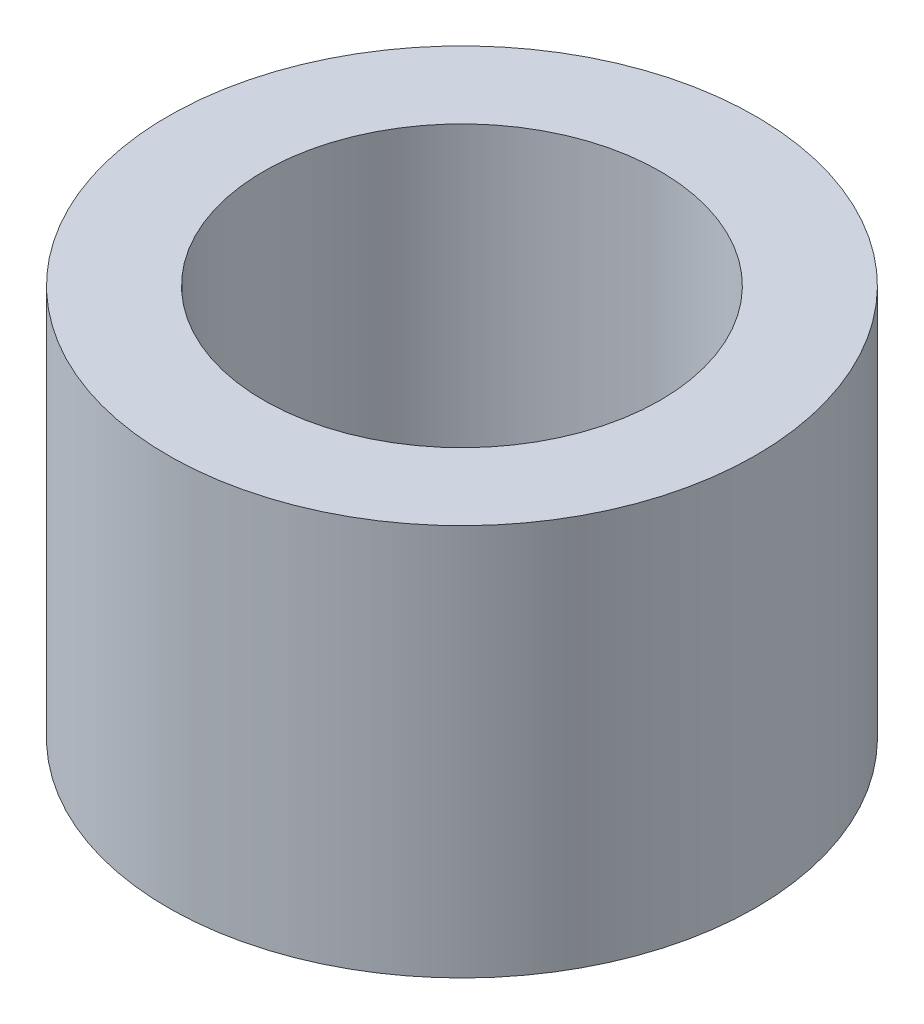
ISO-10303-21;
HEADER;
FILE_DESCRIPTION(('STEP AP214'),'2;1');
FILE_NAME('part.step','',(''),(''),'','','');
FILE_SCHEMA(('AUTOMOTIVE_DESIGN { 1 0 10303 214 1 1 1 1 }'));
ENDSEC;
DATA;
#1=APPLICATION_CONTEXT('core data for automotive mechanical design processes');
#2=APPLICATION_PROTOCOL_DEFINITION('international standard','automotive_design',2000,#1);
#3=PRODUCT_CONTEXT('',#1,'mechanical');
#4=PRODUCT('Part','Part','',(#3));
#5=PRODUCT_RELATED_PRODUCT_CATEGORY('part','',(#4));
#6=PRODUCT_DEFINITION_FORMATION('','',#4);
#7=PRODUCT_DEFINITION_CONTEXT('part definition',#1,'design');
#8=PRODUCT_DEFINITION('design','',#6,#7);
#9=PRODUCT_DEFINITION_SHAPE('','',#8);
#10=(LENGTH_UNIT() NAMED_UNIT(*) SI_UNIT(.MILLI.,.METRE.));
#11=(NAMED_UNIT(*) PLANE_ANGLE_UNIT() SI_UNIT($,.RADIAN.));
#12=(NAMED_UNIT(*) SI_UNIT($,.STERADIAN.) SOLID_ANGLE_UNIT());
#13=UNCERTAINTY_MEASURE_WITH_UNIT(LENGTH_MEASURE(1.E-05),#10,'distance_accuracy_value','');
#14=(GEOMETRIC_REPRESENTATION_CONTEXT(3) GLOBAL_UNCERTAINTY_ASSIGNED_CONTEXT((#13)) GLOBAL_UNIT_ASSIGNED_CONTEXT((#10,
#11,#12)) REPRESENTATION_CONTEXT('',''));
#15=CARTESIAN_POINT('',(0.,0.,0.));
#16=DIRECTION('',(0.,0.,1.));
#17=DIRECTION('',(1.,0.,0.));
#18=AXIS2_PLACEMENT_3D('',#15,#16,#17);
#19=CARTESIAN_POINT('',(-60.,-160.,100.));
#20=DIRECTION('',(0.,1.,0.));
#21=DIRECTION('',(1.,0.,0.));
#22=AXIS2_PLACEMENT_3D('',#19,#20,#21);
#23=CYLINDRICAL_SURFACE('',#22,4.05);
#24=CARTESIAN_POINT('',(-60.,-151.,100.));
#25=DIRECTION('',(0.,-1.,0.));
#26=DIRECTION('',(1.,0.,0.));
#27=AXIS2_PLACEMENT_3D('',#24,#25,#26);
#28=CIRCLE('',#27,4.05);
#29=CARTESIAN_POINT('',(-55.95,-151.,100.));
#30=VERTEX_POINT('',#29);
#31=EDGE_CURVE('E61',#30,#30,#28,.T.);
#32=ORIENTED_EDGE('',*,*,#31,.F.);
#33=DIRECTION('',(0.,1.,0.));
#34=VECTOR('',#33,1.);
#35=CARTESIAN_POINT('',(-55.95,-160.,100.));
#36=LINE('',#35,#34);
#37=CARTESIAN_POINT('',(-55.95,-159.,100.));
#38=VERTEX_POINT('',#37);
#39=EDGE_CURVE('E11',#38,#30,#36,.T.);
#40=ORIENTED_EDGE('',*,*,#39,.F.);
#41=CARTESIAN_POINT('',(-60.,-159.,100.));
#42=DIRECTION('',(0.,-1.,0.));
#43=DIRECTION('',(1.,0.,0.));
#44=AXIS2_PLACEMENT_3D('',#41,#42,#43);
#45=CIRCLE('',#44,4.05);
#46=EDGE_CURVE('E24',#38,#38,#45,.T.);
#47=ORIENTED_EDGE('',*,*,#46,.T.);
#48=ORIENTED_EDGE('',*,*,#39,.T.);
#49=EDGE_LOOP('',(#32,#40,#47,#48));
#50=FACE_BOUND('',#49,.T.);
#51=ADVANCED_FACE('F16',(#50),#23,.F.);
#52=CARTESIAN_POINT('',(-60.,-159.,100.));
#53=DIRECTION('',(0.,1.,0.));
#54=DIRECTION('',(0.,0.,-1.));
#55=AXIS2_PLACEMENT_3D('',#52,#53,#54);
#56=PLANE('',#55);
#57=ORIENTED_EDGE('',*,*,#46,.F.);
#58=EDGE_LOOP('',(#57));
#59=FACE_BOUND('',#58,.T.);
#60=CARTESIAN_POINT('',(-60.,-159.,100.));
#61=DIRECTION('',(0.,-1.,0.));
#62=DIRECTION('',(1.,0.,0.));
#63=AXIS2_PLACEMENT_3D('',#60,#61,#62);
#64=CIRCLE('',#63,6.);
#65=CARTESIAN_POINT('',(-54.,-159.,100.));
#66=VERTEX_POINT('',#65);
#67=EDGE_CURVE('E49',#66,#66,#64,.T.);
#68=ORIENTED_EDGE('',*,*,#67,.T.);
#69=EDGE_LOOP('',(#68));
#70=FACE_BOUND('',#69,.T.);
#71=ADVANCED_FACE('F50',(#59,#70),#56,.F.);
#72=CARTESIAN_POINT('',(-60.,-151.,100.));
#73=DIRECTION('',(0.,1.,0.));
#74=DIRECTION('',(0.,0.,-1.));
#75=AXIS2_PLACEMENT_3D('',#72,#73,#74);
#76=PLANE('',#75);
#77=ORIENTED_EDGE('',*,*,#31,.T.);
#78=EDGE_LOOP('',(#77));
#79=FACE_BOUND('',#78,.T.);
#80=CARTESIAN_POINT('',(-60.,-151.,100.));
#81=DIRECTION('',(0.,-1.,0.));
#82=DIRECTION('',(1.,0.,0.));
#83=AXIS2_PLACEMENT_3D('',#80,#81,#82);
#84=CIRCLE('',#83,6.);
#85=CARTESIAN_POINT('',(-54.,-151.,100.));
#86=VERTEX_POINT('',#85);
#87=EDGE_CURVE('E55',#86,#86,#84,.T.);
#88=ORIENTED_EDGE('',*,*,#87,.F.);
#89=EDGE_LOOP('',(#88));
#90=FACE_BOUND('',#89,.T.);
#91=ADVANCED_FACE('F71',(#79,#90),#76,.T.);
#92=CARTESIAN_POINT('',(-60.,-159.,100.));
#93=DIRECTION('',(0.,1.,0.));
#94=DIRECTION('',(1.,0.,0.));
#95=AXIS2_PLACEMENT_3D('',#92,#93,#94);
#96=CYLINDRICAL_SURFACE('',#95,6.);
#97=DIRECTION('',(0.,1.,0.));
#98=VECTOR('',#97,1.);
#99=CARTESIAN_POINT('',(-54.,-159.,100.));
#100=LINE('',#99,#98);
#101=EDGE_CURVE('E56',#66,#86,#100,.T.);
#102=ORIENTED_EDGE('',*,*,#101,.F.);
#103=ORIENTED_EDGE('',*,*,#67,.F.);
#104=ORIENTED_EDGE('',*,*,#101,.T.);
#105=ORIENTED_EDGE('',*,*,#87,.T.);
#106=EDGE_LOOP('',(#102,#103,#104,#105));
#107=FACE_BOUND('',#106,.T.);
#108=ADVANCED_FACE('F77',(#107),#96,.T.);
#109=CLOSED_SHELL('',(#51,#71,#91,#108));
#110=MANIFOLD_SOLID_BREP('B1',#109);
#111=ADVANCED_BREP_SHAPE_REPRESENTATION('',(#18,#110),#14);
#112=SHAPE_DEFINITION_REPRESENTATION(#9,#111);
ENDSEC;
END-ISO-10303-21;
